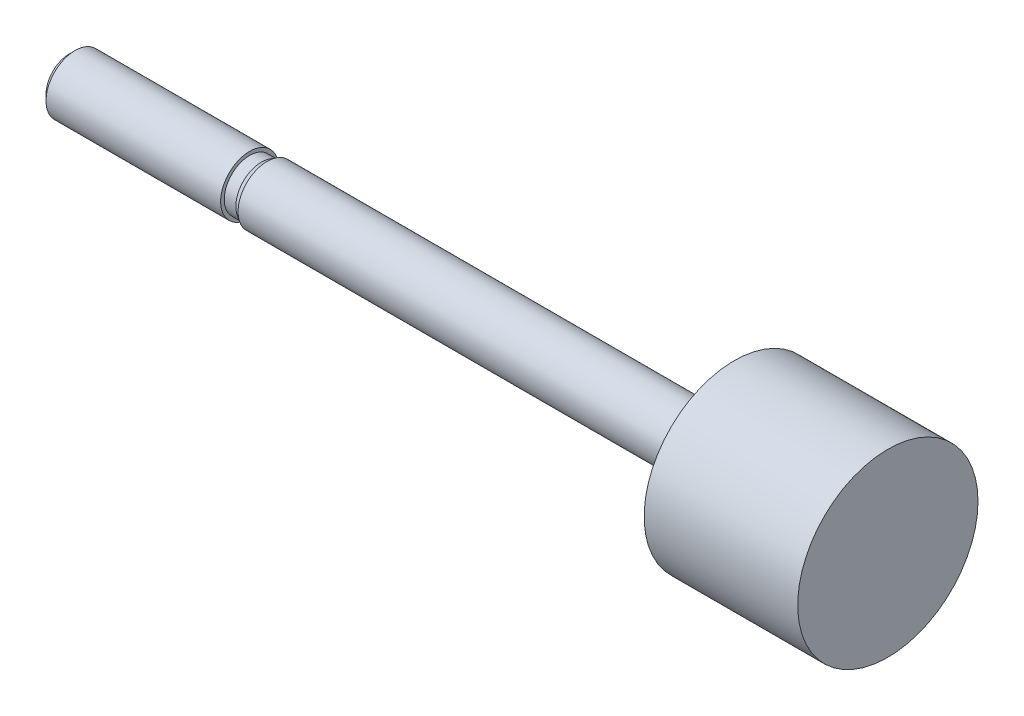
ISO-10303-21;
HEADER;
FILE_DESCRIPTION(('STEP AP214'),'2;1');
FILE_NAME('part.step','',(''),(''),'','','');
FILE_SCHEMA(('AUTOMOTIVE_DESIGN { 1 0 10303 214 1 1 1 1 }'));
ENDSEC;
DATA;
#1=APPLICATION_CONTEXT('core data for automotive mechanical design processes');
#2=APPLICATION_PROTOCOL_DEFINITION('international standard','automotive_design',2000,#1);
#3=PRODUCT_CONTEXT('',#1,'mechanical');
#4=PRODUCT('Part','Part','',(#3));
#5=PRODUCT_RELATED_PRODUCT_CATEGORY('part','',(#4));
#6=PRODUCT_DEFINITION_FORMATION('','',#4);
#7=PRODUCT_DEFINITION_CONTEXT('part definition',#1,'design');
#8=PRODUCT_DEFINITION('design','',#6,#7);
#9=PRODUCT_DEFINITION_SHAPE('','',#8);
#10=(LENGTH_UNIT() NAMED_UNIT(*) SI_UNIT(.MILLI.,.METRE.));
#11=(NAMED_UNIT(*) PLANE_ANGLE_UNIT() SI_UNIT($,.RADIAN.));
#12=(NAMED_UNIT(*) SI_UNIT($,.STERADIAN.) SOLID_ANGLE_UNIT());
#13=UNCERTAINTY_MEASURE_WITH_UNIT(LENGTH_MEASURE(1.E-05),#10,'distance_accuracy_value','');
#14=(GEOMETRIC_REPRESENTATION_CONTEXT(3) GLOBAL_UNCERTAINTY_ASSIGNED_CONTEXT((#13)) GLOBAL_UNIT_ASSIGNED_CONTEXT((#10,
#11,#12)) REPRESENTATION_CONTEXT('',''));
#15=CARTESIAN_POINT('',(0.,0.,0.));
#16=DIRECTION('',(0.,0.,1.));
#17=DIRECTION('',(1.,0.,0.));
#18=AXIS2_PLACEMENT_3D('',#15,#16,#17);
#19=CARTESIAN_POINT('',(70.36,7.75,0.));
#20=DIRECTION('',(-1.,0.,0.));
#21=DIRECTION('',(0.,0.,1.));
#22=AXIS2_PLACEMENT_3D('',#19,#20,#21);
#23=PLANE('',#22);
#24=CARTESIAN_POINT('',(70.36,0.,0.));
#25=DIRECTION('',(1.,0.,0.));
#26=DIRECTION('',(0.,0.,-1.));
#27=AXIS2_PLACEMENT_3D('',#24,#25,#26);
#28=CIRCLE('',#27,7.75);
#29=CARTESIAN_POINT('',(70.36,0.,-7.75));
#30=VERTEX_POINT('',#29);
#31=EDGE_CURVE('E67',#30,#30,#28,.T.);
#32=ORIENTED_EDGE('',*,*,#31,.T.);
#33=EDGE_LOOP('',(#32));
#34=FACE_BOUND('',#33,.T.);
#35=ADVANCED_FACE('F17',(#34),#23,.F.);
#36=CARTESIAN_POINT('',(0.,0.,0.));
#37=DIRECTION('',(1.,0.,0.));
#38=DIRECTION('',(0.,1.,0.));
#39=AXIS2_PLACEMENT_3D('',#36,#37,#38);
#40=PLANE('',#39);
#41=CARTESIAN_POINT('',(0.,0.,0.));
#42=DIRECTION('',(1.,0.,0.));
#43=DIRECTION('',(0.,0.,-1.));
#44=AXIS2_PLACEMENT_3D('',#41,#42,#43);
#45=CIRCLE('',#44,2.0095);
#46=CARTESIAN_POINT('',(0.,0.,-2.0095));
#47=VERTEX_POINT('',#46);
#48=EDGE_CURVE('E11',#47,#47,#45,.T.);
#49=ORIENTED_EDGE('',*,*,#48,.F.);
#50=EDGE_LOOP('',(#49));
#51=FACE_BOUND('',#50,.T.);
#52=ADVANCED_FACE('F101',(#51),#40,.F.);
#53=CARTESIAN_POINT('',(0.,0.,0.));
#54=DIRECTION('',(1.,0.,0.));
#55=DIRECTION('',(0.,0.,-1.));
#56=AXIS2_PLACEMENT_3D('',#53,#54,#55);
#57=CONICAL_SURFACE('',#56,2.0095,0.7853981634);
#58=ORIENTED_EDGE('',*,*,#48,.T.);
#59=EDGE_LOOP('',(#58));
#60=FACE_BOUND('',#59,.T.);
#61=CARTESIAN_POINT('',(0.4905,0.,0.));
#62=DIRECTION('',(1.,0.,0.));
#63=DIRECTION('',(0.,0.,-1.));
#64=AXIS2_PLACEMENT_3D('',#61,#62,#63);
#65=CIRCLE('',#64,2.5);
#66=CARTESIAN_POINT('',(0.4905,0.,-2.5));
#67=VERTEX_POINT('',#66);
#68=EDGE_CURVE('E28',#67,#67,#65,.T.);
#69=ORIENTED_EDGE('',*,*,#68,.F.);
#70=EDGE_LOOP('',(#69));
#71=FACE_BOUND('',#70,.T.);
#72=ADVANCED_FACE('F107',(#60,#71),#57,.T.);
#73=CARTESIAN_POINT('',(70.36,0.,0.));
#74=DIRECTION('',(-1.,0.,0.));
#75=DIRECTION('',(0.,0.,-1.));
#76=AXIS2_PLACEMENT_3D('',#73,#74,#75);
#77=CYLINDRICAL_SURFACE('',#76,2.5);
#78=CARTESIAN_POINT('',(15.5,0.,0.));
#79=DIRECTION('',(1.,0.,0.));
#80=DIRECTION('',(0.,0.,-1.));
#81=AXIS2_PLACEMENT_3D('',#78,#79,#80);
#82=CIRCLE('',#81,2.5);
#83=CARTESIAN_POINT('',(15.5,0.,-2.5));
#84=VERTEX_POINT('',#83);
#85=EDGE_CURVE('E81',#84,#84,#82,.T.);
#86=ORIENTED_EDGE('',*,*,#85,.F.);
#87=EDGE_LOOP('',(#86));
#88=FACE_BOUND('',#87,.T.);
#89=ORIENTED_EDGE('',*,*,#68,.T.);
#90=EDGE_LOOP('',(#89));
#91=FACE_BOUND('',#90,.T.);
#92=ADVANCED_FACE('F138',(#88,#91),#77,.T.);
#93=CARTESIAN_POINT('',(15.5,2.5,0.));
#94=DIRECTION('',(-1.,0.,0.));
#95=DIRECTION('',(0.,0.,1.));
#96=AXIS2_PLACEMENT_3D('',#93,#94,#95);
#97=PLANE('',#96);
#98=CARTESIAN_POINT('',(15.5,0.,0.));
#99=DIRECTION('',(1.,0.,0.));
#100=DIRECTION('',(0.,0.,-1.));
#101=AXIS2_PLACEMENT_3D('',#98,#99,#100);
#102=CIRCLE('',#101,2.19);
#103=CARTESIAN_POINT('',(15.5,0.,-2.19));
#104=VERTEX_POINT('',#103);
#105=EDGE_CURVE('E77',#104,#104,#102,.T.);
#106=ORIENTED_EDGE('',*,*,#105,.F.);
#107=EDGE_LOOP('',(#106));
#108=FACE_BOUND('',#107,.T.);
#109=ORIENTED_EDGE('',*,*,#85,.T.);
#110=EDGE_LOOP('',(#109));
#111=FACE_BOUND('',#110,.T.);
#112=ADVANCED_FACE('F131',(#108,#111),#97,.F.);
#113=CARTESIAN_POINT('',(70.36,0.,0.));
#114=DIRECTION('',(-1.,0.,0.));
#115=DIRECTION('',(0.,0.,-1.));
#116=AXIS2_PLACEMENT_3D('',#113,#114,#115);
#117=CYLINDRICAL_SURFACE('',#116,2.19);
#118=CARTESIAN_POINT('',(16.5,0.,0.));
#119=DIRECTION('',(1.,0.,0.));
#120=DIRECTION('',(0.,0.,-1.));
#121=AXIS2_PLACEMENT_3D('',#118,#119,#120);
#122=CIRCLE('',#121,2.19);
#123=CARTESIAN_POINT('',(16.5,0.,-2.19));
#124=VERTEX_POINT('',#123);
#125=EDGE_CURVE('E21',#124,#124,#122,.T.);
#126=ORIENTED_EDGE('',*,*,#125,.F.);
#127=EDGE_LOOP('',(#126));
#128=FACE_BOUND('',#127,.T.);
#129=ORIENTED_EDGE('',*,*,#105,.T.);
#130=EDGE_LOOP('',(#129));
#131=FACE_BOUND('',#130,.T.);
#132=ADVANCED_FACE('F78',(#128,#131),#117,.T.);
#133=CARTESIAN_POINT('',(16.5,0.,0.));
#134=DIRECTION('',(1.,0.,0.));
#135=DIRECTION('',(0.,0.,-1.));
#136=AXIS2_PLACEMENT_3D('',#133,#134,#135);
#137=CONICAL_SURFACE('',#136,2.19,0.5549957273);
#138=ORIENTED_EDGE('',*,*,#125,.T.);
#139=EDGE_LOOP('',(#138));
#140=FACE_BOUND('',#139,.T.);
#141=CARTESIAN_POINT('',(17.,0.,0.));
#142=DIRECTION('',(1.,0.,0.));
#143=DIRECTION('',(0.,0.,-1.));
#144=AXIS2_PLACEMENT_3D('',#141,#142,#143);
#145=CIRCLE('',#144,2.5);
#146=CARTESIAN_POINT('',(17.,0.,-2.5));
#147=VERTEX_POINT('',#146);
#148=EDGE_CURVE('E87',#147,#147,#145,.T.);
#149=ORIENTED_EDGE('',*,*,#148,.F.);
#150=EDGE_LOOP('',(#149));
#151=FACE_BOUND('',#150,.T.);
#152=ADVANCED_FACE('F121',(#140,#151),#137,.T.);
#153=CARTESIAN_POINT('',(70.36,0.,0.));
#154=DIRECTION('',(-1.,0.,0.));
#155=DIRECTION('',(0.,0.,-1.));
#156=AXIS2_PLACEMENT_3D('',#153,#154,#155);
#157=CYLINDRICAL_SURFACE('',#156,2.5);
#158=CARTESIAN_POINT('',(57.16,0.,0.));
#159=DIRECTION('',(1.,0.,0.));
#160=DIRECTION('',(0.,0.,-1.));
#161=AXIS2_PLACEMENT_3D('',#158,#159,#160);
#162=CIRCLE('',#161,2.5);
#163=CARTESIAN_POINT('',(57.16,0.,-2.5));
#164=VERTEX_POINT('',#163);
#165=EDGE_CURVE('E58',#164,#164,#162,.T.);
#166=ORIENTED_EDGE('',*,*,#165,.F.);
#167=EDGE_LOOP('',(#166));
#168=FACE_BOUND('',#167,.T.);
#169=ORIENTED_EDGE('',*,*,#148,.T.);
#170=EDGE_LOOP('',(#169));
#171=FACE_BOUND('',#170,.T.);
#172=ADVANCED_FACE('F116',(#168,#171),#157,.T.);
#173=CARTESIAN_POINT('',(57.16,2.5,0.));
#174=DIRECTION('',(1.,0.,0.));
#175=DIRECTION('',(0.,1.,0.));
#176=AXIS2_PLACEMENT_3D('',#173,#174,#175);
#177=PLANE('',#176);
#178=ORIENTED_EDGE('',*,*,#165,.T.);
#179=EDGE_LOOP('',(#178));
#180=FACE_BOUND('',#179,.T.);
#181=CARTESIAN_POINT('',(57.16,0.,0.));
#182=DIRECTION('',(1.,0.,0.));
#183=DIRECTION('',(0.,0.,-1.));
#184=AXIS2_PLACEMENT_3D('',#181,#182,#183);
#185=CIRCLE('',#184,7.75);
#186=CARTESIAN_POINT('',(57.16,0.,-7.75));
#187=VERTEX_POINT('',#186);
#188=EDGE_CURVE('E92',#187,#187,#185,.T.);
#189=ORIENTED_EDGE('',*,*,#188,.F.);
#190=EDGE_LOOP('',(#189));
#191=FACE_BOUND('',#190,.T.);
#192=ADVANCED_FACE('F120',(#180,#191),#177,.F.);
#193=CARTESIAN_POINT('',(70.36,0.,0.));
#194=DIRECTION('',(-1.,0.,0.));
#195=DIRECTION('',(0.,0.,-1.));
#196=AXIS2_PLACEMENT_3D('',#193,#194,#195);
#197=CYLINDRICAL_SURFACE('',#196,7.75);
#198=ORIENTED_EDGE('',*,*,#31,.F.);
#199=EDGE_LOOP('',(#198));
#200=FACE_BOUND('',#199,.T.);
#201=ORIENTED_EDGE('',*,*,#188,.T.);
#202=EDGE_LOOP('',(#201));
#203=FACE_BOUND('',#202,.T.);
#204=ADVANCED_FACE('F19',(#200,#203),#197,.T.);
#205=CLOSED_SHELL('',(#35,#52,#72,#92,#112,#132,#152,#172,#192,#204));
#206=MANIFOLD_SOLID_BREP('B1',#205);
#207=ADVANCED_BREP_SHAPE_REPRESENTATION('',(#18,#206),#14);
#208=SHAPE_DEFINITION_REPRESENTATION(#9,#207);
ENDSEC;
END-ISO-10303-21;
